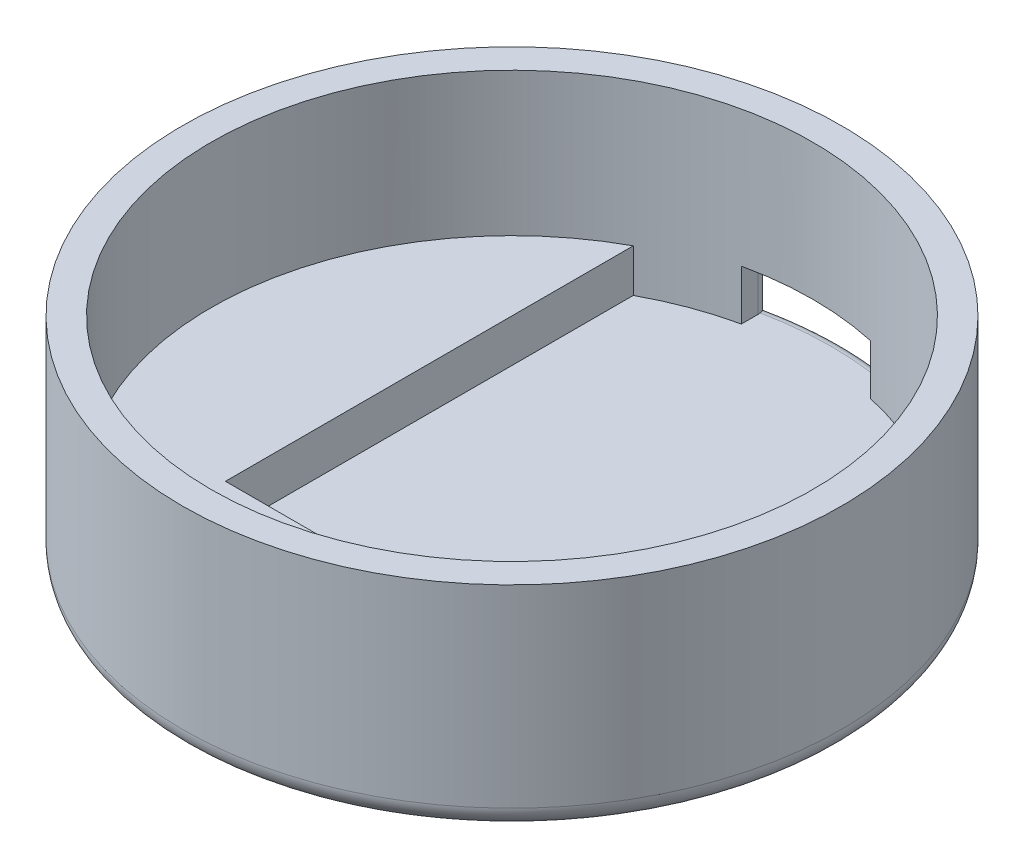
ISO-10303-21;
HEADER;
FILE_DESCRIPTION(('STEP AP214'),'2;1');
FILE_NAME('part.step','',(''),(''),'','','');
FILE_SCHEMA(('AUTOMOTIVE_DESIGN { 1 0 10303 214 1 1 1 1 }'));
ENDSEC;
DATA;
#1=APPLICATION_CONTEXT('core data for automotive mechanical design processes');
#2=APPLICATION_PROTOCOL_DEFINITION('international standard','automotive_design',2000,#1);
#3=PRODUCT_CONTEXT('',#1,'mechanical');
#4=PRODUCT('Part','Part','',(#3));
#5=PRODUCT_RELATED_PRODUCT_CATEGORY('part','',(#4));
#6=PRODUCT_DEFINITION_FORMATION('','',#4);
#7=PRODUCT_DEFINITION_CONTEXT('part definition',#1,'design');
#8=PRODUCT_DEFINITION('design','',#6,#7);
#9=PRODUCT_DEFINITION_SHAPE('','',#8);
#10=(LENGTH_UNIT() NAMED_UNIT(*) SI_UNIT(.MILLI.,.METRE.));
#11=(NAMED_UNIT(*) PLANE_ANGLE_UNIT() SI_UNIT($,.RADIAN.));
#12=(NAMED_UNIT(*) SI_UNIT($,.STERADIAN.) SOLID_ANGLE_UNIT());
#13=UNCERTAINTY_MEASURE_WITH_UNIT(LENGTH_MEASURE(1.E-05),#10,'distance_accuracy_value','');
#14=(GEOMETRIC_REPRESENTATION_CONTEXT(3) GLOBAL_UNCERTAINTY_ASSIGNED_CONTEXT((#13)) GLOBAL_UNIT_ASSIGNED_CONTEXT((#10,
#11,#12)) REPRESENTATION_CONTEXT('',''));
#15=CARTESIAN_POINT('',(0.,0.,0.));
#16=DIRECTION('',(0.,0.,1.));
#17=DIRECTION('',(1.,0.,0.));
#18=AXIS2_PLACEMENT_3D('',#15,#16,#17);
#19=CARTESIAN_POINT('',(-5.2,15.,-21.6852484422014));
#20=DIRECTION('',(0.,-1.,0.));
#21=DIRECTION('',(0.,0.,-1.));
#22=AXIS2_PLACEMENT_3D('',#19,#20,#21);
#23=CYLINDRICAL_SURFACE('',#22,0.7);
#24=CARTESIAN_POINT('',(-4.51681909436285,5.5,-21.8377733587653));
#25=CARTESIAN_POINT('',(-4.52025067215088,5.49999787200724,-21.8531537154296));
#26=CARTESIAN_POINT('',(-4.52420406077069,5.50053245899546,-21.8684073702478));
#27=CARTESIAN_POINT('',(-4.53310083153568,5.50264677984689,-21.8985360409807));
#28=CARTESIAN_POINT('',(-4.53804340747271,5.50422566498518,-21.9134113541958));
#29=CARTESIAN_POINT('',(-4.5541822568279,5.51044840615257,-21.9570436491858));
#30=CARTESIAN_POINT('',(-4.56675633616595,5.5165795360701,-21.9851007758357));
#31=CARTESIAN_POINT('',(-4.59489262713005,5.53231405185442,-22.0384555995321));
#32=CARTESIAN_POINT('',(-4.6104461620999,5.54190742511715,-22.0637609826138));
#33=CARTESIAN_POINT('',(-4.64391943516525,5.56399086025079,-22.1114233103494));
#34=CARTESIAN_POINT('',(-4.66184454436348,5.5764875475726,-22.1337733248845));
#35=CARTESIAN_POINT('',(-4.70709280295214,5.60936083761866,-22.1838456517783));
#36=CARTESIAN_POINT('',(-4.73527016097548,5.6308738319636,-22.2100484876801));
#37=CARTESIAN_POINT('',(-4.79374352775837,5.67715557926991,-22.2565245180746));
#38=CARTESIAN_POINT('',(-4.82404335573541,5.70193027568716,-22.2767866645673));
#39=CARTESIAN_POINT('',(-4.89735019520692,5.76342102960648,-22.3183197574693));
#40=CARTESIAN_POINT('',(-4.94088597182729,5.80114735563131,-22.3371544538196));
#41=CARTESIAN_POINT('',(-5.0286237990448,5.8791903343774,-22.3655129041933));
#42=CARTESIAN_POINT('',(-5.07282660268026,5.91951011338483,-22.3750251875263));
#43=CARTESIAN_POINT('',(-5.15809236020181,5.99903863438692,-22.3852268372309));
#44=CARTESIAN_POINT('',(-5.19917931563953,6.03816002326746,-22.3864291035493));
#45=CARTESIAN_POINT('',(-5.28029042863051,6.11694263583135,-22.3818104514124));
#46=CARTESIAN_POINT('',(-5.32031664479752,6.15660254705692,-22.3760043388979));
#47=CARTESIAN_POINT('',(-5.3607455101863,6.19748639939764,-22.366543169161));
#48=CARTESIAN_POINT('',(-5.3619875331322,6.19874322172795,-22.366248928632));
#49=CARTESIAN_POINT('',(-5.36322869955157,6.2,-22.3659513081001));
#50=B_SPLINE_CURVE_WITH_KNOTS('',3,(#24,#25,#26,#27,#28,#29,#30,#31,#32,#33,#34,#35,#36,#37,#38,
#39,#40,#41,#42,#43,#44,#45,#46,#47,#48,#49),.UNSPECIFIED.,.F.,.F.,(4,2,2,2,2,2,2,2,2,2,2,2,4),
(0.,0.0472387255548335,0.0944391062175906,0.187950309310705,0.281193222485926,0.374651045980818,
0.506173483044328,0.637938985293337,0.818792081059518,0.99986742776038,1.16965817307087,
1.33909084441709,1.34446476602593),.UNSPECIFIED.);
#51=CARTESIAN_POINT('',(-4.51681909436285,5.5,-21.8377733587653));
#52=VERTEX_POINT('',#51);
#53=CARTESIAN_POINT('',(-5.36322869955157,6.2,-22.3659513081001));
#54=VERTEX_POINT('',#53);
#55=EDGE_CURVE('E11',#52,#54,#50,.T.);
#56=ORIENTED_EDGE('',*,*,#55,.F.);
#57=CARTESIAN_POINT('',(-5.2,5.5,-21.6852484422014));
#58=DIRECTION('',(0.,1.,0.));
#59=DIRECTION('',(0.,0.,1.));
#60=AXIS2_PLACEMENT_3D('',#57,#58,#59);
#61=CIRCLE('',#60,0.7);
#62=CARTESIAN_POINT('',(-4.5,5.5,-21.6852484422014));
#63=VERTEX_POINT('',#62);
#64=EDGE_CURVE('E277',#63,#52,#61,.T.);
#65=ORIENTED_EDGE('',*,*,#64,.F.);
#66=DIRECTION('',(0.,-1.,0.));
#67=VECTOR('',#66,1.);
#68=CARTESIAN_POINT('',(-4.5,5.5,-21.6852484422014));
#69=LINE('',#68,#67);
#70=CARTESIAN_POINT('',(-4.5,2.,-21.6852484422014));
#71=VERTEX_POINT('',#70);
#72=EDGE_CURVE('E282',#71,#63,#69,.F.);
#73=ORIENTED_EDGE('',*,*,#72,.F.);
#74=CARTESIAN_POINT('',(-5.2,2.,-21.6852484422014));
#75=DIRECTION('',(0.,1.,0.));
#76=DIRECTION('',(0.,0.,1.));
#77=AXIS2_PLACEMENT_3D('',#74,#75,#76);
#78=CIRCLE('',#77,0.7);
#79=CARTESIAN_POINT('',(-4.51681909436275,2.00000000000011,-21.8377733587653));
#80=VERTEX_POINT('',#79);
#81=EDGE_CURVE('E253',#80,#71,#78,.F.);
#82=ORIENTED_EDGE('',*,*,#81,.F.);
#83=CARTESIAN_POINT('',(-4.51681909436285,2.,-21.8377733587653));
#84=CARTESIAN_POINT('',(-4.52025067215088,2.00000212799276,-21.8531537154296));
#85=CARTESIAN_POINT('',(-4.52420406077069,1.99946754100454,-21.8684073702478));
#86=CARTESIAN_POINT('',(-4.53310083153568,1.99735322015311,-21.8985360409807));
#87=CARTESIAN_POINT('',(-4.53804340747271,1.99577433501482,-21.9134113541958));
#88=CARTESIAN_POINT('',(-4.5541822568279,1.98955159384743,-21.9570436491858));
#89=CARTESIAN_POINT('',(-4.56675633616595,1.98342046392989,-21.9851007758357));
#90=CARTESIAN_POINT('',(-4.59489262713005,1.96768594814558,-22.0384555995321));
#91=CARTESIAN_POINT('',(-4.6104461620999,1.95809257488285,-22.0637609826138));
#92=CARTESIAN_POINT('',(-4.64391943516525,1.93600913974921,-22.1114233103494));
#93=CARTESIAN_POINT('',(-4.66184454436349,1.92351245242739,-22.1337733248845));
#94=CARTESIAN_POINT('',(-4.70709280295214,1.89063916238134,-22.1838456517783));
#95=CARTESIAN_POINT('',(-4.73527016097549,1.8691261680364,-22.2100484876801));
#96=CARTESIAN_POINT('',(-4.79374352775837,1.82284442073009,-22.2565245180746));
#97=CARTESIAN_POINT('',(-4.8240433557354,1.79806972431283,-22.2767866645673));
#98=CARTESIAN_POINT('',(-4.89735019520693,1.73657897039353,-22.3183197574693));
#99=CARTESIAN_POINT('',(-4.94088597182733,1.69885264436873,-22.3371544538196));
#100=CARTESIAN_POINT('',(-5.02862379904476,1.62080966562255,-22.3655129041933));
#101=CARTESIAN_POINT('',(-5.0728266026801,1.580489886615,-22.3750251875264));
#102=CARTESIAN_POINT('',(-5.15809236020197,1.50096136561323,-22.3852268372309));
#103=CARTESIAN_POINT('',(-5.19917931564007,1.46183997673311,-22.3864291035492));
#104=CARTESIAN_POINT('',(-5.28029042862997,1.38305736416809,-22.3818104514125));
#105=CARTESIAN_POINT('',(-5.32031664479552,1.34339745294099,-22.3760043388983));
#106=CARTESIAN_POINT('',(-5.36074551018618,1.30251360060223,-22.366543169161));
#107=CARTESIAN_POINT('',(-5.36198753313214,1.30125677827198,-22.3662489286321));
#108=CARTESIAN_POINT('',(-5.36322869955157,1.3,-22.3659513081001));
#109=B_SPLINE_CURVE_WITH_KNOTS('',3,(#83,#84,#85,#86,#87,#88,#89,#90,#91,#92,#93,#94,#95,#96,
#97,#98,#99,#100,#101,#102,#103,#104,#105,#106,#107,#108),.UNSPECIFIED.,.F.,.F.,(4,2,2,2,2,2,2,
2,2,2,2,2,4),(0.,0.0472387255548335,0.0944391062175909,0.187950309310705,0.281193222485927,
0.374651045980819,0.506173483044333,0.63793898529334,0.818792081059522,0.999867427760387,
1.16965817307088,1.33909084441709,1.34446476602593),.UNSPECIFIED.);
#110=CARTESIAN_POINT('',(-5.28198014730338,1.38113033005143,-22.3804313357252));
#111=VERTEX_POINT('',#110);
#112=EDGE_CURVE('E46',#80,#111,#109,.T.);
#113=ORIENTED_EDGE('',*,*,#112,.T.);
#114=CARTESIAN_POINT('',(-5.36322869955157,1.5,-22.3659513081001));
#115=CARTESIAN_POINT('',(-5.36179756663143,1.49787867776072,-22.3662944830226));
#116=CARTESIAN_POINT('',(-5.36036526466216,1.49575723239502,-22.3666331682414));
#117=CARTESIAN_POINT('',(-5.29343995740352,1.39670546184629,-22.382235847453));
#118=CARTESIAN_POINT('',(-5.22555095739936,1.29954406820203,-22.3881177429545));
#119=CARTESIAN_POINT('',(-5.12253913884223,1.15446563763046,-22.3818195969974));
#120=CARTESIAN_POINT('',(-5.08773218693907,1.10584420921458,-22.3771034393487));
#121=CARTESIAN_POINT('',(-5.01837220297058,1.00927427288328,-22.3621978035392));
#122=CARTESIAN_POINT('',(-4.98381915637731,0.961325726321847,-22.3520086410438));
#123=CARTESIAN_POINT('',(-4.94962778332606,0.913802383949327,-22.3389408416668));
#124=B_SPLINE_CURVE_WITH_KNOTS('',3,(#114,#115,#116,#117,#118,#119,#120,#121,#122,#123),
.UNSPECIFIED.,.F.,.F.,(4,2,2,2,4),(0.,0.00774597920970788,0.361646317093406,0.541392915161139,
0.721129147136203),.UNSPECIFIED.);
#125=CARTESIAN_POINT('',(-5.36322869955157,1.5,-22.3659513081001));
#126=VERTEX_POINT('',#125);
#127=EDGE_CURVE('E219',#126,#111,#124,.T.);
#128=ORIENTED_EDGE('',*,*,#127,.F.);
#129=DIRECTION('',(0.,-1.,0.));
#130=VECTOR('',#129,1.);
#131=CARTESIAN_POINT('',(-5.36322869955157,15.,-22.3659513081001));
#132=LINE('',#131,#130);
#133=EDGE_CURVE('E209',#54,#126,#132,.T.);
#134=ORIENTED_EDGE('',*,*,#133,.F.);
#135=EDGE_LOOP('',(#56,#65,#73,#82,#113,#128,#134));
#136=FACE_BOUND('',#135,.T.);
#137=ADVANCED_FACE('F33',(#136),#23,.T.);
#138=CARTESIAN_POINT('',(0.,1.3,0.));
#139=DIRECTION('',(0.,1.,0.));
#140=DIRECTION('',(0.,0.,1.));
#141=AXIS2_PLACEMENT_3D('',#138,#139,#140);
#142=TOROIDAL_SURFACE('',#141,22.3,0.7);
#143=ORIENTED_EDGE('',*,*,#112,.F.);
#144=CARTESIAN_POINT('',(0.,2.,0.));
#145=DIRECTION('',(0.,1.,0.));
#146=DIRECTION('',(0.,0.,1.));
#147=AXIS2_PLACEMENT_3D('',#144,#145,#146);
#148=CIRCLE('',#147,22.3);
#149=CARTESIAN_POINT('',(4.51681909436285,2.,-21.8377733587653));
#150=VERTEX_POINT('',#149);
#151=EDGE_CURVE('E53',#150,#80,#148,.T.);
#152=ORIENTED_EDGE('',*,*,#151,.F.);
#153=CARTESIAN_POINT('',(4.51681909436285,2.,-21.8377733587653));
#154=CARTESIAN_POINT('',(4.52025067215088,2.00000212799276,-21.8531537154296));
#155=CARTESIAN_POINT('',(4.52420406077069,1.99946754100454,-21.8684073702478));
#156=CARTESIAN_POINT('',(4.53310083153568,1.99735322015311,-21.8985360409807));
#157=CARTESIAN_POINT('',(4.53804340747271,1.99577433501482,-21.9134113541958));
#158=CARTESIAN_POINT('',(4.5541822568279,1.98955159384743,-21.9570436491858));
#159=CARTESIAN_POINT('',(4.56675633616595,1.98342046392989,-21.9851007758357));
#160=CARTESIAN_POINT('',(4.59489262713005,1.96768594814558,-22.0384555995321));
#161=CARTESIAN_POINT('',(4.6104461620999,1.95809257488285,-22.0637609826138));
#162=CARTESIAN_POINT('',(4.64391943516525,1.93600913974921,-22.1114233103494));
#163=CARTESIAN_POINT('',(4.66184454436349,1.92351245242739,-22.1337733248845));
#164=CARTESIAN_POINT('',(4.70709280295214,1.89063916238134,-22.1838456517783));
#165=CARTESIAN_POINT('',(4.73527016097549,1.8691261680364,-22.2100484876801));
#166=CARTESIAN_POINT('',(4.79374352775837,1.82284442073009,-22.2565245180746));
#167=CARTESIAN_POINT('',(4.8240433557354,1.79806972431283,-22.2767866645673));
#168=CARTESIAN_POINT('',(4.89735019520693,1.73657897039353,-22.3183197574693));
#169=CARTESIAN_POINT('',(4.94088597182733,1.69885264436873,-22.3371544538196));
#170=CARTESIAN_POINT('',(5.02862379904476,1.62080966562255,-22.3655129041933));
#171=CARTESIAN_POINT('',(5.0728266026801,1.580489886615,-22.3750251875264));
#172=CARTESIAN_POINT('',(5.15809236020197,1.50096136561323,-22.3852268372309));
#173=CARTESIAN_POINT('',(5.19917931564007,1.46183997673311,-22.3864291035492));
#174=CARTESIAN_POINT('',(5.28029042862997,1.38305736416809,-22.3818104514125));
#175=CARTESIAN_POINT('',(5.32031664479552,1.34339745294099,-22.3760043388983));
#176=CARTESIAN_POINT('',(5.36074551018618,1.30251360060223,-22.366543169161));
#177=CARTESIAN_POINT('',(5.36198753313214,1.30125677827198,-22.3662489286321));
#178=CARTESIAN_POINT('',(5.36322869955157,1.3,-22.3659513081001));
#179=B_SPLINE_CURVE_WITH_KNOTS('',3,(#153,#154,#155,#156,#157,#158,#159,#160,#161,#162,#163,
#164,#165,#166,#167,#168,#169,#170,#171,#172,#173,#174,#175,#176,#177,#178),.UNSPECIFIED.,.F.,
.F.,(4,2,2,2,2,2,2,2,2,2,2,2,4),(0.,0.0472387255548335,0.0944391062175909,0.187950309310705,
0.281193222485927,0.374651045980819,0.506173483044333,0.63793898529334,0.818792081059522,
0.999867427760387,1.16965817307088,1.33909084441709,1.34446476602593),.UNSPECIFIED.);
#180=CARTESIAN_POINT('',(5.2819801473136,1.38113033005206,-22.380431335723));
#181=VERTEX_POINT('',#180);
#182=EDGE_CURVE('E243',#150,#181,#179,.T.);
#183=ORIENTED_EDGE('',*,*,#182,.T.);
#184=CARTESIAN_POINT('',(0.,1.38113033005206,0.));
#185=DIRECTION('',(0.,-1.,0.));
#186=DIRECTION('',(0.,0.,-1.));
#187=AXIS2_PLACEMENT_3D('',#184,#185,#186);
#188=CIRCLE('',#187,22.995282582513);
#189=EDGE_CURVE('E226',#111,#181,#188,.T.);
#190=ORIENTED_EDGE('',*,*,#189,.F.);
#191=EDGE_LOOP('',(#143,#152,#183,#190));
#192=FACE_BOUND('',#191,.T.);
#193=ADVANCED_FACE('F35',(#192),#142,.T.);
#194=CARTESIAN_POINT('',(5.2,15.,-21.6852484422014));
#195=DIRECTION('',(0.,-1.,0.));
#196=DIRECTION('',(0.,0.,-1.));
#197=AXIS2_PLACEMENT_3D('',#194,#195,#196);
#198=CYLINDRICAL_SURFACE('',#197,0.7);
#199=ORIENTED_EDGE('',*,*,#182,.F.);
#200=CARTESIAN_POINT('',(5.2,2.,-21.6852484422014));
#201=DIRECTION('',(0.,1.,0.));
#202=DIRECTION('',(0.,0.,1.));
#203=AXIS2_PLACEMENT_3D('',#200,#201,#202);
#204=CIRCLE('',#203,0.7);
#205=CARTESIAN_POINT('',(4.5,2.,-21.6852484422014));
#206=VERTEX_POINT('',#205);
#207=EDGE_CURVE('E284',#206,#150,#204,.F.);
#208=ORIENTED_EDGE('',*,*,#207,.F.);
#209=DIRECTION('',(0.,-1.,0.));
#210=VECTOR('',#209,1.);
#211=CARTESIAN_POINT('',(4.5,5.5,-21.6852484422014));
#212=LINE('',#211,#210);
#213=CARTESIAN_POINT('',(4.5,5.5,-21.6852484422014));
#214=VERTEX_POINT('',#213);
#215=EDGE_CURVE('E144',#214,#206,#212,.T.);
#216=ORIENTED_EDGE('',*,*,#215,.F.);
#217=CARTESIAN_POINT('',(5.2,5.5,-21.6852484422014));
#218=DIRECTION('',(0.,1.,0.));
#219=DIRECTION('',(0.,0.,1.));
#220=AXIS2_PLACEMENT_3D('',#217,#218,#219);
#221=CIRCLE('',#220,0.7);
#222=CARTESIAN_POINT('',(4.51681909436275,5.49999999999989,-21.8377733587653));
#223=VERTEX_POINT('',#222);
#224=EDGE_CURVE('E281',#223,#214,#221,.T.);
#225=ORIENTED_EDGE('',*,*,#224,.F.);
#226=CARTESIAN_POINT('',(4.51681909436285,5.5,-21.8377733587653));
#227=CARTESIAN_POINT('',(4.52025067215088,5.49999787200724,-21.8531537154296));
#228=CARTESIAN_POINT('',(4.52420406077069,5.50053245899546,-21.8684073702478));
#229=CARTESIAN_POINT('',(4.53310083153568,5.50264677984689,-21.8985360409807));
#230=CARTESIAN_POINT('',(4.53804340747271,5.50422566498518,-21.9134113541958));
#231=CARTESIAN_POINT('',(4.5541822568279,5.51044840615257,-21.9570436491858));
#232=CARTESIAN_POINT('',(4.56675633616595,5.5165795360701,-21.9851007758357));
#233=CARTESIAN_POINT('',(4.59489262713005,5.53231405185442,-22.0384555995321));
#234=CARTESIAN_POINT('',(4.6104461620999,5.54190742511715,-22.0637609826138));
#235=CARTESIAN_POINT('',(4.64391943516525,5.56399086025079,-22.1114233103494));
#236=CARTESIAN_POINT('',(4.66184454436348,5.5764875475726,-22.1337733248845));
#237=CARTESIAN_POINT('',(4.70709280295214,5.60936083761866,-22.1838456517783));
#238=CARTESIAN_POINT('',(4.73527016097548,5.6308738319636,-22.2100484876801));
#239=CARTESIAN_POINT('',(4.79374352775837,5.67715557926991,-22.2565245180746));
#240=CARTESIAN_POINT('',(4.82404335573541,5.70193027568716,-22.2767866645673));
#241=CARTESIAN_POINT('',(4.89735019520692,5.76342102960648,-22.3183197574693));
#242=CARTESIAN_POINT('',(4.94088597182729,5.80114735563131,-22.3371544538196));
#243=CARTESIAN_POINT('',(5.0286237990448,5.8791903343774,-22.3655129041933));
#244=CARTESIAN_POINT('',(5.07282660268026,5.91951011338483,-22.3750251875263));
#245=CARTESIAN_POINT('',(5.15809236020181,5.99903863438692,-22.3852268372309));
#246=CARTESIAN_POINT('',(5.19917931563953,6.03816002326746,-22.3864291035493));
#247=CARTESIAN_POINT('',(5.28029042863051,6.11694263583135,-22.3818104514124));
#248=CARTESIAN_POINT('',(5.32031664479752,6.15660254705692,-22.3760043388979));
#249=CARTESIAN_POINT('',(5.3607455101863,6.19748639939764,-22.366543169161));
#250=CARTESIAN_POINT('',(5.3619875331322,6.19874322172795,-22.366248928632));
#251=CARTESIAN_POINT('',(5.36322869955157,6.2,-22.3659513081001));
#252=B_SPLINE_CURVE_WITH_KNOTS('',3,(#226,#227,#228,#229,#230,#231,#232,#233,#234,#235,#236,
#237,#238,#239,#240,#241,#242,#243,#244,#245,#246,#247,#248,#249,#250,#251),.UNSPECIFIED.,.F.,
.F.,(4,2,2,2,2,2,2,2,2,2,2,2,4),(0.,0.0472387255548335,0.0944391062175906,0.187950309310705,
0.281193222485926,0.374651045980818,0.506173483044328,0.637938985293337,0.818792081059518,
0.99986742776038,1.16965817307087,1.33909084441709,1.34446476602593),.UNSPECIFIED.);
#253=CARTESIAN_POINT('',(5.36322869955157,6.2,-22.3659513081001));
#254=VERTEX_POINT('',#253);
#255=EDGE_CURVE('E248',#223,#254,#252,.T.);
#256=ORIENTED_EDGE('',*,*,#255,.T.);
#257=DIRECTION('',(0.,-1.,0.));
#258=VECTOR('',#257,1.);
#259=CARTESIAN_POINT('',(5.36322869955157,15.,-22.3659513081001));
#260=LINE('',#259,#258);
#261=CARTESIAN_POINT('',(5.36322869955157,1.5,-22.3659513081001));
#262=VERTEX_POINT('',#261);
#263=EDGE_CURVE('E215',#262,#254,#260,.F.);
#264=ORIENTED_EDGE('',*,*,#263,.F.);
#265=CARTESIAN_POINT('',(5.28198014730705,1.38113033005675,-22.3804313357248));
#266=CARTESIAN_POINT('',(5.3079373660699,1.41862209731074,-22.377363777708));
#267=CARTESIAN_POINT('',(5.33358792151417,1.45612387954559,-22.3728757847584));
#268=CARTESIAN_POINT('',(5.36036508973125,1.4957570858104,-22.3666332168638));
#269=CARTESIAN_POINT('',(5.36179738503516,1.49787852688997,-22.3662945339386));
#270=CARTESIAN_POINT('',(5.36322869955157,1.5,-22.3659513081001));
#271=B_SPLINE_CURVE_WITH_KNOTS('',3,(#265,#266,#267,#268,#269,#270),.UNSPECIFIED.,.F.,.F.,(4,2,
4),(0.,0.136968210599934,0.144714189811103),.UNSPECIFIED.);
#272=EDGE_CURVE('E354',#181,#262,#271,.T.);
#273=ORIENTED_EDGE('',*,*,#272,.F.);
#274=EDGE_LOOP('',(#199,#208,#216,#225,#256,#264,#273));
#275=FACE_BOUND('',#274,.T.);
#276=ADVANCED_FACE('F235',(#275),#198,.T.);
#277=CARTESIAN_POINT('',(0.,6.2,0.));
#278=DIRECTION('',(0.,1.,0.));
#279=DIRECTION('',(0.,0.,1.));
#280=AXIS2_PLACEMENT_3D('',#277,#278,#279);
#281=TOROIDAL_SURFACE('',#280,22.3,0.7);
#282=CARTESIAN_POINT('',(0.,5.5,0.));
#283=DIRECTION('',(0.,1.,0.));
#284=DIRECTION('',(0.,0.,1.));
#285=AXIS2_PLACEMENT_3D('',#282,#283,#284);
#286=CIRCLE('',#285,22.3);
#287=EDGE_CURVE('E207',#52,#223,#286,.F.);
#288=ORIENTED_EDGE('',*,*,#287,.F.);
#289=ORIENTED_EDGE('',*,*,#55,.T.);
#290=CARTESIAN_POINT('',(0.,6.2,0.));
#291=DIRECTION('',(0.,1.,0.));
#292=DIRECTION('',(0.,0.,1.));
#293=AXIS2_PLACEMENT_3D('',#290,#291,#292);
#294=CIRCLE('',#293,23.);
#295=EDGE_CURVE('E212',#254,#54,#294,.T.);
#296=ORIENTED_EDGE('',*,*,#295,.F.);
#297=ORIENTED_EDGE('',*,*,#255,.F.);
#298=EDGE_LOOP('',(#288,#289,#296,#297));
#299=FACE_BOUND('',#298,.T.);
#300=ADVANCED_FACE('F255',(#299),#281,.T.);
#301=CARTESIAN_POINT('',(0.,5.,0.));
#302=DIRECTION('',(0.,1.,0.));
#303=DIRECTION('',(0.,0.,1.));
#304=AXIS2_PLACEMENT_3D('',#301,#302,#303);
#305=PLANE('',#304);
#306=DIRECTION('',(1.,0.,0.));
#307=VECTOR('',#306,1.);
#308=CARTESIAN_POINT('',(0.,5.,10.));
#309=LINE('',#308,#307);
#310=CARTESIAN_POINT('',(-10.,5.,10.));
#311=VERTEX_POINT('',#310);
#312=CARTESIAN_POINT('',(10.,5.,10.));
#313=VERTEX_POINT('',#312);
#314=EDGE_CURVE('E174',#311,#313,#309,.T.);
#315=ORIENTED_EDGE('',*,*,#314,.F.);
#316=DIRECTION('',(0.,0.,-1.));
#317=VECTOR('',#316,1.);
#318=CARTESIAN_POINT('',(-10.,5.,0.));
#319=LINE('',#318,#317);
#320=CARTESIAN_POINT('',(-10.,5.,-18.4661853126194));
#321=VERTEX_POINT('',#320);
#322=EDGE_CURVE('E171',#311,#321,#319,.T.);
#323=ORIENTED_EDGE('',*,*,#322,.T.);
#324=CARTESIAN_POINT('',(0.,5.,0.));
#325=DIRECTION('',(0.,1.,0.));
#326=DIRECTION('',(0.,0.,1.));
#327=AXIS2_PLACEMENT_3D('',#324,#325,#326);
#328=CIRCLE('',#327,21.);
#329=CARTESIAN_POINT('',(21.,5.,0.));
#330=VERTEX_POINT('',#329);
#331=EDGE_CURVE('E193',#321,#330,#328,.T.);
#332=ORIENTED_EDGE('',*,*,#331,.T.);
#333=DIRECTION('',(-1.,0.,0.));
#334=VECTOR('',#333,1.);
#335=CARTESIAN_POINT('',(0.,5.,0.));
#336=LINE('',#335,#334);
#337=CARTESIAN_POINT('',(10.,5.,0.));
#338=VERTEX_POINT('',#337);
#339=EDGE_CURVE('E180',#330,#338,#336,.T.);
#340=ORIENTED_EDGE('',*,*,#339,.T.);
#341=DIRECTION('',(0.,0.,-1.));
#342=VECTOR('',#341,1.);
#343=CARTESIAN_POINT('',(10.,5.,0.));
#344=LINE('',#343,#342);
#345=EDGE_CURVE('E178',#313,#338,#344,.T.);
#346=ORIENTED_EDGE('',*,*,#345,.F.);
#347=EDGE_LOOP('',(#315,#323,#332,#340,#346));
#348=FACE_BOUND('',#347,.T.);
#349=ADVANCED_FACE('F258',(#348),#305,.T.);
#350=CARTESIAN_POINT('',(0.,15.,0.));
#351=DIRECTION('',(0.,-1.,0.));
#352=DIRECTION('',(0.,0.,-1.));
#353=AXIS2_PLACEMENT_3D('',#350,#351,#352);
#354=CYLINDRICAL_SURFACE('',#353,23.);
#355=CARTESIAN_POINT('',(0.,1.5,0.));
#356=DIRECTION('',(0.,1.,0.));
#357=DIRECTION('',(0.,0.,1.));
#358=AXIS2_PLACEMENT_3D('',#355,#356,#357);
#359=CIRCLE('',#358,23.);
#360=EDGE_CURVE('E201',#126,#262,#359,.T.);
#361=ORIENTED_EDGE('',*,*,#360,.T.);
#362=ORIENTED_EDGE('',*,*,#263,.T.);
#363=ORIENTED_EDGE('',*,*,#295,.T.);
#364=ORIENTED_EDGE('',*,*,#133,.T.);
#365=EDGE_LOOP('',(#361,#362,#363,#364));
#366=FACE_BOUND('',#365,.T.);
#367=CARTESIAN_POINT('',(0.,15.,0.));
#368=DIRECTION('',(0.,1.,0.));
#369=DIRECTION('',(0.,0.,1.));
#370=AXIS2_PLACEMENT_3D('',#367,#368,#369);
#371=CIRCLE('',#370,23.);
#372=CARTESIAN_POINT('',(0.,15.,23.));
#373=VERTEX_POINT('',#372);
#374=EDGE_CURVE('E196',#373,#373,#371,.T.);
#375=ORIENTED_EDGE('',*,*,#374,.F.);
#376=EDGE_LOOP('',(#375));
#377=FACE_BOUND('',#376,.T.);
#378=ADVANCED_FACE('F265',(#366,#377),#354,.T.);
#379=CARTESIAN_POINT('',(0.,15.,0.));
#380=DIRECTION('',(0.,1.,0.));
#381=DIRECTION('',(0.,0.,1.));
#382=AXIS2_PLACEMENT_3D('',#379,#380,#381);
#383=PLANE('',#382);
#384=CARTESIAN_POINT('',(0.,15.,0.));
#385=DIRECTION('',(0.,1.,0.));
#386=DIRECTION('',(0.,0.,1.));
#387=AXIS2_PLACEMENT_3D('',#384,#385,#386);
#388=CIRCLE('',#387,21.);
#389=CARTESIAN_POINT('',(0.,15.,21.));
#390=VERTEX_POINT('',#389);
#391=EDGE_CURVE('E186',#390,#390,#388,.T.);
#392=ORIENTED_EDGE('',*,*,#391,.F.);
#393=EDGE_LOOP('',(#392));
#394=FACE_BOUND('',#393,.T.);
#395=ORIENTED_EDGE('',*,*,#374,.T.);
#396=EDGE_LOOP('',(#395));
#397=FACE_BOUND('',#396,.T.);
#398=ADVANCED_FACE('F336',(#394,#397),#383,.T.);
#399=CARTESIAN_POINT('',(0.,0.,0.));
#400=DIRECTION('',(0.,1.,0.));
#401=DIRECTION('',(0.,0.,1.));
#402=AXIS2_PLACEMENT_3D('',#399,#400,#401);
#403=PLANE('',#402);
#404=CARTESIAN_POINT('',(0.,0.,0.));
#405=DIRECTION('',(0.,1.,0.));
#406=DIRECTION('',(0.,0.,1.));
#407=AXIS2_PLACEMENT_3D('',#404,#405,#406);
#408=CIRCLE('',#407,21.5);
#409=CARTESIAN_POINT('',(0.,0.,21.5));
#410=VERTEX_POINT('',#409);
#411=EDGE_CURVE('E204',#410,#410,#408,.F.);
#412=ORIENTED_EDGE('',*,*,#411,.T.);
#413=EDGE_LOOP('',(#412));
#414=FACE_BOUND('',#413,.T.);
#415=ADVANCED_FACE('F335',(#414),#403,.F.);
#416=CARTESIAN_POINT('',(0.,5.,0.));
#417=DIRECTION('',(0.,1.,0.));
#418=DIRECTION('',(0.,0.,1.));
#419=AXIS2_PLACEMENT_3D('',#416,#417,#418);
#420=CYLINDRICAL_SURFACE('',#419,21.);
#421=CARTESIAN_POINT('',(0.,2.,0.));
#422=DIRECTION('',(0.,1.,0.));
#423=DIRECTION('',(0.,0.,1.));
#424=AXIS2_PLACEMENT_3D('',#421,#422,#423);
#425=CIRCLE('',#424,21.);
#426=CARTESIAN_POINT('',(-4.5,2.,-20.512191496766));
#427=VERTEX_POINT('',#426);
#428=CARTESIAN_POINT('',(-10.,2.,-18.4661853126194));
#429=VERTEX_POINT('',#428);
#430=EDGE_CURVE('E164',#427,#429,#425,.T.);
#431=ORIENTED_EDGE('',*,*,#430,.F.);
#432=DIRECTION('',(0.,1.,0.));
#433=VECTOR('',#432,1.);
#434=CARTESIAN_POINT('',(-4.5,5.,-20.512191496766));
#435=LINE('',#434,#433);
#436=CARTESIAN_POINT('',(-4.5,5.5,-20.512191496766));
#437=VERTEX_POINT('',#436);
#438=EDGE_CURVE('E293',#437,#427,#435,.F.);
#439=ORIENTED_EDGE('',*,*,#438,.F.);
#440=CARTESIAN_POINT('',(0.,5.5,0.));
#441=DIRECTION('',(0.,1.,0.));
#442=DIRECTION('',(0.,0.,1.));
#443=AXIS2_PLACEMENT_3D('',#440,#441,#442);
#444=CIRCLE('',#443,21.);
#445=CARTESIAN_POINT('',(4.5,5.5,-20.512191496766));
#446=VERTEX_POINT('',#445);
#447=EDGE_CURVE('E157',#446,#437,#444,.T.);
#448=ORIENTED_EDGE('',*,*,#447,.F.);
#449=DIRECTION('',(0.,1.,0.));
#450=VECTOR('',#449,1.);
#451=CARTESIAN_POINT('',(4.5,5.,-20.512191496766));
#452=LINE('',#451,#450);
#453=CARTESIAN_POINT('',(4.5,2.,-20.512191496766));
#454=VERTEX_POINT('',#453);
#455=EDGE_CURVE('E141',#454,#446,#452,.T.);
#456=ORIENTED_EDGE('',*,*,#455,.F.);
#457=CARTESIAN_POINT('',(21.,2.,0.));
#458=VERTEX_POINT('',#457);
#459=EDGE_CURVE('E154',#458,#454,#425,.T.);
#460=ORIENTED_EDGE('',*,*,#459,.F.);
#461=DIRECTION('',(0.,1.,0.));
#462=VECTOR('',#461,1.);
#463=CARTESIAN_POINT('',(21.,2.,0.));
#464=LINE('',#463,#462);
#465=EDGE_CURVE('E187',#458,#330,#464,.T.);
#466=ORIENTED_EDGE('',*,*,#465,.T.);
#467=ORIENTED_EDGE('',*,*,#331,.F.);
#468=DIRECTION('',(0.,1.,0.));
#469=VECTOR('',#468,1.);
#470=CARTESIAN_POINT('',(-10.,2.,-18.4661853126194));
#471=LINE('',#470,#469);
#472=EDGE_CURVE('E184',#429,#321,#471,.T.);
#473=ORIENTED_EDGE('',*,*,#472,.F.);
#474=EDGE_LOOP('',(#431,#439,#448,#456,#460,#466,#467,#473));
#475=FACE_BOUND('',#474,.T.);
#476=ORIENTED_EDGE('',*,*,#391,.T.);
#477=EDGE_LOOP('',(#476));
#478=FACE_BOUND('',#477,.T.);
#479=ADVANCED_FACE('F152',(#475,#478),#420,.F.);
#480=CARTESIAN_POINT('',(-10.,2.,0.));
#481=DIRECTION('',(1.,0.,0.));
#482=DIRECTION('',(0.,0.,-1.));
#483=AXIS2_PLACEMENT_3D('',#480,#481,#482);
#484=PLANE('',#483);
#485=ORIENTED_EDGE('',*,*,#322,.F.);
#486=DIRECTION('',(0.,1.,0.));
#487=VECTOR('',#486,1.);
#488=CARTESIAN_POINT('',(-10.,2.,10.));
#489=LINE('',#488,#487);
#490=CARTESIAN_POINT('',(-10.,2.,10.));
#491=VERTEX_POINT('',#490);
#492=EDGE_CURVE('E163',#491,#311,#489,.T.);
#493=ORIENTED_EDGE('',*,*,#492,.F.);
#494=DIRECTION('',(0.,0.,-1.));
#495=VECTOR('',#494,1.);
#496=CARTESIAN_POINT('',(-10.,2.,0.));
#497=LINE('',#496,#495);
#498=EDGE_CURVE('E183',#491,#429,#497,.T.);
#499=ORIENTED_EDGE('',*,*,#498,.T.);
#500=ORIENTED_EDGE('',*,*,#472,.T.);
#501=EDGE_LOOP('',(#485,#493,#499,#500));
#502=FACE_BOUND('',#501,.T.);
#503=ADVANCED_FACE('F316',(#502),#484,.T.);
#504=CARTESIAN_POINT('',(0.,2.,0.));
#505=DIRECTION('',(0.,0.,-1.));
#506=DIRECTION('',(-1.,0.,0.));
#507=AXIS2_PLACEMENT_3D('',#504,#505,#506);
#508=PLANE('',#507);
#509=ORIENTED_EDGE('',*,*,#339,.F.);
#510=ORIENTED_EDGE('',*,*,#465,.F.);
#511=DIRECTION('',(-1.,0.,0.));
#512=VECTOR('',#511,1.);
#513=CARTESIAN_POINT('',(0.,2.,0.));
#514=LINE('',#513,#512);
#515=CARTESIAN_POINT('',(10.,2.,0.));
#516=VERTEX_POINT('',#515);
#517=EDGE_CURVE('E162',#458,#516,#514,.T.);
#518=ORIENTED_EDGE('',*,*,#517,.T.);
#519=DIRECTION('',(0.,1.,0.));
#520=VECTOR('',#519,1.);
#521=CARTESIAN_POINT('',(10.,2.,0.));
#522=LINE('',#521,#520);
#523=EDGE_CURVE('E189',#516,#338,#522,.T.);
#524=ORIENTED_EDGE('',*,*,#523,.T.);
#525=EDGE_LOOP('',(#509,#510,#518,#524));
#526=FACE_BOUND('',#525,.T.);
#527=ADVANCED_FACE('F307',(#526),#508,.T.);
#528=CARTESIAN_POINT('',(10.,2.,0.));
#529=DIRECTION('',(1.,0.,0.));
#530=DIRECTION('',(0.,0.,-1.));
#531=AXIS2_PLACEMENT_3D('',#528,#529,#530);
#532=PLANE('',#531);
#533=ORIENTED_EDGE('',*,*,#345,.T.);
#534=ORIENTED_EDGE('',*,*,#523,.F.);
#535=DIRECTION('',(0.,0.,-1.));
#536=VECTOR('',#535,1.);
#537=CARTESIAN_POINT('',(10.,2.,0.));
#538=LINE('',#537,#536);
#539=CARTESIAN_POINT('',(10.,2.,10.));
#540=VERTEX_POINT('',#539);
#541=EDGE_CURVE('E302',#540,#516,#538,.T.);
#542=ORIENTED_EDGE('',*,*,#541,.F.);
#543=DIRECTION('',(0.,1.,0.));
#544=VECTOR('',#543,1.);
#545=CARTESIAN_POINT('',(10.,2.,10.));
#546=LINE('',#545,#544);
#547=EDGE_CURVE('E166',#540,#313,#546,.T.);
#548=ORIENTED_EDGE('',*,*,#547,.T.);
#549=EDGE_LOOP('',(#533,#534,#542,#548));
#550=FACE_BOUND('',#549,.T.);
#551=ADVANCED_FACE('F309',(#550),#532,.F.);
#552=CARTESIAN_POINT('',(0.,2.,10.));
#553=DIRECTION('',(0.,0.,1.));
#554=DIRECTION('',(1.,0.,0.));
#555=AXIS2_PLACEMENT_3D('',#552,#553,#554);
#556=PLANE('',#555);
#557=ORIENTED_EDGE('',*,*,#314,.T.);
#558=ORIENTED_EDGE('',*,*,#547,.F.);
#559=DIRECTION('',(1.,0.,0.));
#560=VECTOR('',#559,1.);
#561=CARTESIAN_POINT('',(0.,2.,10.));
#562=LINE('',#561,#560);
#563=EDGE_CURVE('E300',#491,#540,#562,.T.);
#564=ORIENTED_EDGE('',*,*,#563,.F.);
#565=ORIENTED_EDGE('',*,*,#492,.T.);
#566=EDGE_LOOP('',(#557,#558,#564,#565));
#567=FACE_BOUND('',#566,.T.);
#568=ADVANCED_FACE('F320',(#567),#556,.F.);
#569=CARTESIAN_POINT('',(0.,2.,0.));
#570=DIRECTION('',(0.,1.,0.));
#571=DIRECTION('',(0.,0.,1.));
#572=AXIS2_PLACEMENT_3D('',#569,#570,#571);
#573=PLANE('',#572);
#574=DIRECTION('',(0.,0.,1.));
#575=VECTOR('',#574,1.);
#576=CARTESIAN_POINT('',(4.5,2.,-23.001));
#577=LINE('',#576,#575);
#578=EDGE_CURVE('E137',#206,#454,#577,.T.);
#579=ORIENTED_EDGE('',*,*,#578,.F.);
#580=ORIENTED_EDGE('',*,*,#207,.T.);
#581=ORIENTED_EDGE('',*,*,#151,.T.);
#582=ORIENTED_EDGE('',*,*,#81,.T.);
#583=DIRECTION('',(0.,0.,1.));
#584=VECTOR('',#583,1.);
#585=CARTESIAN_POINT('',(-4.5,2.,-23.001));
#586=LINE('',#585,#584);
#587=EDGE_CURVE('E147',#71,#427,#586,.T.);
#588=ORIENTED_EDGE('',*,*,#587,.T.);
#589=ORIENTED_EDGE('',*,*,#430,.T.);
#590=ORIENTED_EDGE('',*,*,#498,.F.);
#591=ORIENTED_EDGE('',*,*,#563,.T.);
#592=ORIENTED_EDGE('',*,*,#541,.T.);
#593=ORIENTED_EDGE('',*,*,#517,.F.);
#594=ORIENTED_EDGE('',*,*,#459,.T.);
#595=EDGE_LOOP('',(#579,#580,#581,#582,#588,#589,#590,#591,#592,#593,#594));
#596=FACE_BOUND('',#595,.T.);
#597=ADVANCED_FACE('F160',(#596),#573,.T.);
#598=CARTESIAN_POINT('',(-4.5,5.5,-23.001));
#599=DIRECTION('',(-1.,0.,0.));
#600=DIRECTION('',(0.,-1.,0.));
#601=AXIS2_PLACEMENT_3D('',#598,#599,#600);
#602=PLANE('',#601);
#603=ORIENTED_EDGE('',*,*,#587,.F.);
#604=ORIENTED_EDGE('',*,*,#72,.T.);
#605=DIRECTION('',(0.,0.,1.));
#606=VECTOR('',#605,1.);
#607=CARTESIAN_POINT('',(-4.5,5.5,-23.001));
#608=LINE('',#607,#606);
#609=EDGE_CURVE('E175',#63,#437,#608,.T.);
#610=ORIENTED_EDGE('',*,*,#609,.T.);
#611=ORIENTED_EDGE('',*,*,#438,.T.);
#612=EDGE_LOOP('',(#603,#604,#610,#611));
#613=FACE_BOUND('',#612,.T.);
#614=ADVANCED_FACE('F292',(#613),#602,.F.);
#615=CARTESIAN_POINT('',(4.5,5.5,-23.001));
#616=DIRECTION('',(1.,0.,0.));
#617=DIRECTION('',(0.,1.,0.));
#618=AXIS2_PLACEMENT_3D('',#615,#616,#617);
#619=PLANE('',#618);
#620=DIRECTION('',(0.,0.,1.));
#621=VECTOR('',#620,1.);
#622=CARTESIAN_POINT('',(4.5,5.5,-23.001));
#623=LINE('',#622,#621);
#624=EDGE_CURVE('E146',#214,#446,#623,.T.);
#625=ORIENTED_EDGE('',*,*,#624,.F.);
#626=ORIENTED_EDGE('',*,*,#215,.T.);
#627=ORIENTED_EDGE('',*,*,#578,.T.);
#628=ORIENTED_EDGE('',*,*,#455,.T.);
#629=EDGE_LOOP('',(#625,#626,#627,#628));
#630=FACE_BOUND('',#629,.T.);
#631=ADVANCED_FACE('F140',(#630),#619,.F.);
#632=CARTESIAN_POINT('',(-4.5,5.5,-23.001));
#633=DIRECTION('',(0.,1.,0.));
#634=DIRECTION('',(0.,0.,1.));
#635=AXIS2_PLACEMENT_3D('',#632,#633,#634);
#636=PLANE('',#635);
#637=ORIENTED_EDGE('',*,*,#609,.F.);
#638=ORIENTED_EDGE('',*,*,#64,.T.);
#639=ORIENTED_EDGE('',*,*,#287,.T.);
#640=ORIENTED_EDGE('',*,*,#224,.T.);
#641=ORIENTED_EDGE('',*,*,#624,.T.);
#642=ORIENTED_EDGE('',*,*,#447,.T.);
#643=EDGE_LOOP('',(#637,#638,#639,#640,#641,#642));
#644=FACE_BOUND('',#643,.T.);
#645=ADVANCED_FACE('F280',(#644),#636,.F.);
#646=CARTESIAN_POINT('',(0.,1.5,0.));
#647=DIRECTION('',(0.,1.,0.));
#648=DIRECTION('',(0.,0.,1.));
#649=AXIS2_PLACEMENT_3D('',#646,#647,#648);
#650=TOROIDAL_SURFACE('',#649,21.5,1.5);
#651=ORIENTED_EDGE('',*,*,#411,.F.);
#652=EDGE_LOOP('',(#651));
#653=FACE_BOUND('',#652,.T.);
#654=ORIENTED_EDGE('',*,*,#189,.T.);
#655=ORIENTED_EDGE('',*,*,#272,.T.);
#656=ORIENTED_EDGE('',*,*,#360,.F.);
#657=ORIENTED_EDGE('',*,*,#127,.T.);
#658=EDGE_LOOP('',(#654,#655,#656,#657));
#659=FACE_BOUND('',#658,.T.);
#660=ADVANCED_FACE('F228',(#653,#659),#650,.T.);
#661=CLOSED_SHELL('',(#137,#193,#276,#300,#349,#378,#398,#415,#479,#503,#527,#551,#568,#597,
#614,#631,#645,#660));
#662=MANIFOLD_SOLID_BREP('B2',#661);
#663=ADVANCED_BREP_SHAPE_REPRESENTATION('',(#18,#662),#14);
#664=SHAPE_DEFINITION_REPRESENTATION(#9,#663);
ENDSEC;
END-ISO-10303-21;
